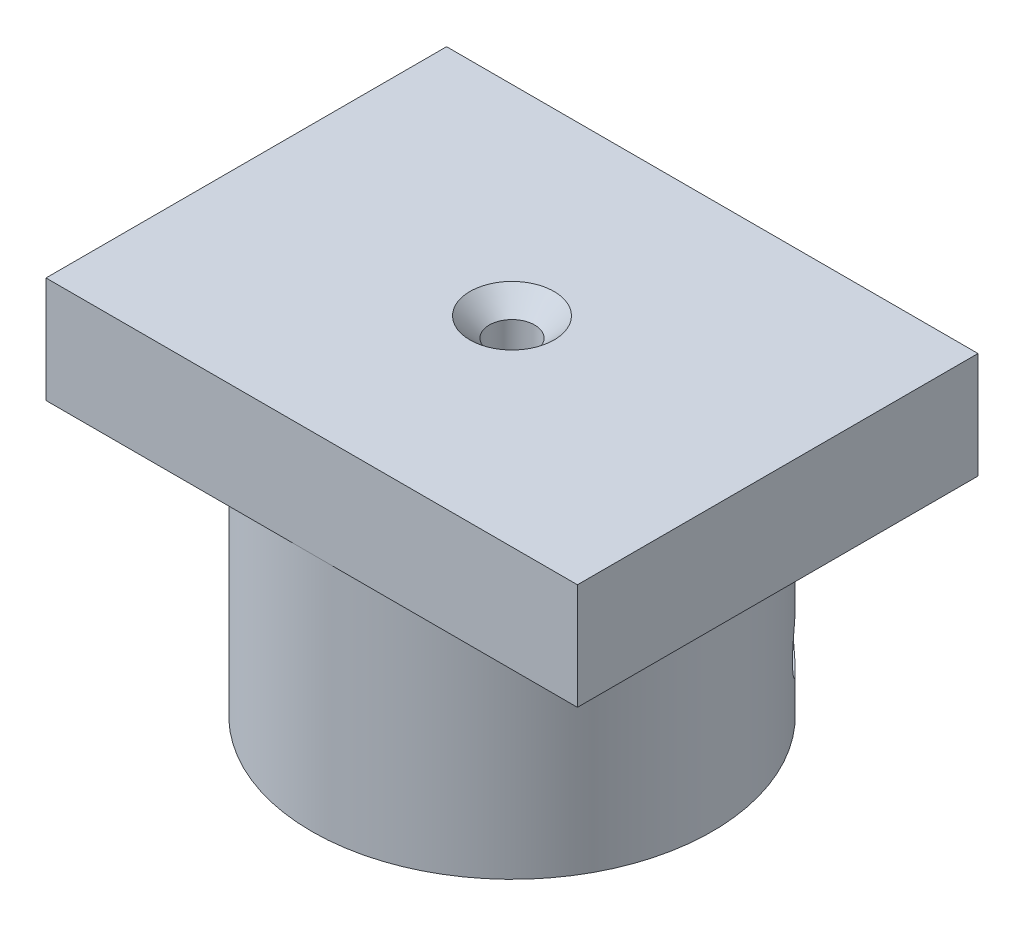
ISO-10303-21;
HEADER;
FILE_DESCRIPTION(('STEP AP214'),'2;1');
FILE_NAME('part.step','',(''),(''),'','','');
FILE_SCHEMA(('AUTOMOTIVE_DESIGN { 1 0 10303 214 1 1 1 1 }'));
ENDSEC;
DATA;
#1=APPLICATION_CONTEXT('core data for automotive mechanical design processes');
#2=APPLICATION_PROTOCOL_DEFINITION('international standard','automotive_design',2000,#1);
#3=PRODUCT_CONTEXT('',#1,'mechanical');
#4=PRODUCT('Part','Part','',(#3));
#5=PRODUCT_RELATED_PRODUCT_CATEGORY('part','',(#4));
#6=PRODUCT_DEFINITION_FORMATION('','',#4);
#7=PRODUCT_DEFINITION_CONTEXT('part definition',#1,'design');
#8=PRODUCT_DEFINITION('design','',#6,#7);
#9=PRODUCT_DEFINITION_SHAPE('','',#8);
#10=(LENGTH_UNIT() NAMED_UNIT(*) SI_UNIT(.MILLI.,.METRE.));
#11=(NAMED_UNIT(*) PLANE_ANGLE_UNIT() SI_UNIT($,.RADIAN.));
#12=(NAMED_UNIT(*) SI_UNIT($,.STERADIAN.) SOLID_ANGLE_UNIT());
#13=UNCERTAINTY_MEASURE_WITH_UNIT(LENGTH_MEASURE(1.E-05),#10,'distance_accuracy_value','');
#14=(GEOMETRIC_REPRESENTATION_CONTEXT(3) GLOBAL_UNCERTAINTY_ASSIGNED_CONTEXT((#13)) GLOBAL_UNIT_ASSIGNED_CONTEXT((#10,
#11,#12)) REPRESENTATION_CONTEXT('',''));
#15=CARTESIAN_POINT('',(0.,0.,0.));
#16=DIRECTION('',(0.,0.,1.));
#17=DIRECTION('',(1.,0.,0.));
#18=AXIS2_PLACEMENT_3D('',#15,#16,#17);
#19=CARTESIAN_POINT('',(0.,-9.,0.));
#20=DIRECTION('',(0.,1.,0.));
#21=DIRECTION('',(0.,0.,1.));
#22=AXIS2_PLACEMENT_3D('',#19,#20,#21);
#23=PLANE('',#22);
#24=CARTESIAN_POINT('',(0.,-9.,0.));
#25=DIRECTION('',(0.,1.,0.));
#26=DIRECTION('',(0.,0.,1.));
#27=AXIS2_PLACEMENT_3D('',#24,#25,#26);
#28=CIRCLE('',#27,15.);
#29=CARTESIAN_POINT('',(0.,-9.,15.));
#30=VERTEX_POINT('',#29);
#31=EDGE_CURVE('E122',#30,#30,#28,.T.);
#32=ORIENTED_EDGE('',*,*,#31,.F.);
#33=EDGE_LOOP('',(#32));
#34=FACE_BOUND('',#33,.T.);
#35=CARTESIAN_POINT('',(0.,-9.,0.));
#36=DIRECTION('',(0.,1.,0.));
#37=DIRECTION('',(0.,0.,1.));
#38=AXIS2_PLACEMENT_3D('',#35,#36,#37);
#39=CIRCLE('',#38,4.5);
#40=CARTESIAN_POINT('',(0.,-9.,4.5));
#41=VERTEX_POINT('',#40);
#42=EDGE_CURVE('E115',#41,#41,#39,.T.);
#43=ORIENTED_EDGE('',*,*,#42,.T.);
#44=EDGE_LOOP('',(#43));
#45=FACE_BOUND('',#44,.T.);
#46=ADVANCED_FACE('F42',(#34,#45),#23,.F.);
#47=CARTESIAN_POINT('',(0.,9.,0.));
#48=DIRECTION('',(0.,-1.,0.));
#49=DIRECTION('',(0.,0.,-1.));
#50=AXIS2_PLACEMENT_3D('',#47,#48,#49);
#51=CYLINDRICAL_SURFACE('',#50,15.);
#52=CARTESIAN_POINT('',(-11.9870668790203,-4.,-9.01721839803683));
#53=CARTESIAN_POINT('',(-11.9870647194374,-4.11733609285982,-9.01722318233425));
#54=CARTESIAN_POINT('',(-11.9810834568195,-4.23474250448934,-9.02518949997445));
#55=CARTESIAN_POINT('',(-11.9572380782288,-4.46627915364104,-9.05675624858933));
#56=CARTESIAN_POINT('',(-11.9393620234722,-4.58040597926817,-9.08037238716647));
#57=CARTESIAN_POINT('',(-11.89202471621,-4.80199815598241,-9.14227851980523));
#58=CARTESIAN_POINT('',(-11.8625719205642,-4.90946830361192,-9.18055780185832));
#59=CARTESIAN_POINT('',(-11.7925656103785,-5.11482926416158,-9.27030853006771));
#60=CARTESIAN_POINT('',(-11.7520137790941,-5.2127215265893,-9.32177797575742));
#61=CARTESIAN_POINT('',(-11.6601992916187,-5.3968492951197,-9.43637436255996));
#62=CARTESIAN_POINT('',(-11.6088713042299,-5.48300815716717,-9.49957212291628));
#63=CARTESIAN_POINT('',(-11.496583565522,-5.64056008303764,-9.63515952584124));
#64=CARTESIAN_POINT('',(-11.4356233066221,-5.71195236826536,-9.70754965276992));
#65=CARTESIAN_POINT('',(-11.3050035809226,-5.83822431074465,-9.85935835043236));
#66=CARTESIAN_POINT('',(-11.2353088946526,-5.89303386095597,-9.93880497397696));
#67=CARTESIAN_POINT('',(-11.0889741160552,-5.98413496420969,-10.1018134811016));
#68=CARTESIAN_POINT('',(-11.0123343446941,-6.02042737250593,-10.1853751744229));
#69=CARTESIAN_POINT('',(-10.8545306330568,-6.07323294311556,-10.3533739769108));
#70=CARTESIAN_POINT('',(-10.7733996203009,-6.08987412402075,-10.4378017648972));
#71=CARTESIAN_POINT('',(-10.608352955659,-6.10330204563422,-10.6055025569267));
#72=CARTESIAN_POINT('',(-10.5244374397326,-6.10008975431735,-10.6887756170713));
#73=CARTESIAN_POINT('',(-10.3568572549031,-6.07400360278592,-10.8512228151495));
#74=CARTESIAN_POINT('',(-10.2731949381095,-6.05126744941544,-10.9304215530207));
#75=CARTESIAN_POINT('',(-10.1080772220635,-5.9869947497972,-11.0832956509178));
#76=CARTESIAN_POINT('',(-10.0266218735772,-5.94545777146888,-11.1569708839573));
#77=CARTESIAN_POINT('',(-9.86823619922424,-5.84461923586762,-11.2973076052182));
#78=CARTESIAN_POINT('',(-9.79132183269602,-5.7852590253779,-11.3639449388141));
#79=CARTESIAN_POINT('',(-9.64484794469365,-5.65050179684024,-11.4885232952984));
#80=CARTESIAN_POINT('',(-9.57528884603068,-5.57510385762688,-11.5464638183386));
#81=CARTESIAN_POINT('',(-9.44535198486033,-5.40964253899311,-11.6530021918276));
#82=CARTESIAN_POINT('',(-9.38505801416977,-5.31945901562705,-11.7015157211278));
#83=CARTESIAN_POINT('',(-9.27656347101683,-5.12739659410495,-11.787713375521));
#84=CARTESIAN_POINT('',(-9.22836295600759,-5.02551764039006,-11.825397449166));
#85=CARTESIAN_POINT('',(-9.14586123091402,-4.81284002266163,-11.8893213041074));
#86=CARTESIAN_POINT('',(-9.11156861410267,-4.70203589456799,-11.9155540107095));
#87=CARTESIAN_POINT('',(-9.05829232273532,-4.47471532580373,-11.9561060396704));
#88=CARTESIAN_POINT('',(-9.03930771443453,-4.35819923400655,-11.9704260886689));
#89=CARTESIAN_POINT('',(-9.01751718312126,-4.12381656861352,-11.9868499372337));
#90=CARTESIAN_POINT('',(-9.01457589236332,-4.00596972893498,-11.9890559517411));
#91=CARTESIAN_POINT('',(-9.02462828094582,-3.77134786415677,-11.9814908260189));
#92=CARTESIAN_POINT('',(-9.03762153152549,-3.65457281030306,-11.9717200080573));
#93=CARTESIAN_POINT('',(-9.07892273504474,-3.425922600359,-11.9404280327459));
#94=CARTESIAN_POINT('',(-9.10716450316938,-3.31402851081475,-11.9189576525965));
#95=CARTESIAN_POINT('',(-9.17780881968122,-3.09772142332984,-11.8646449046075));
#96=CARTESIAN_POINT('',(-9.22021198357903,-2.99330875080096,-11.8318020424724));
#97=CARTESIAN_POINT('',(-9.31790005449787,-2.79417235905164,-11.7550248327029));
#98=CARTESIAN_POINT('',(-9.37326797074399,-2.69951698858569,-11.7110188530569));
#99=CARTESIAN_POINT('',(-9.49470933842137,-2.52328252675306,-11.6127765556547));
#100=CARTESIAN_POINT('',(-9.56078331499997,-2.44170407721847,-11.55853973604));
#101=CARTESIAN_POINT('',(-9.70183516839116,-2.29334139805609,-11.440406530351));
#102=CARTESIAN_POINT('',(-9.77687382387436,-2.22666810836978,-11.3764433000043));
#103=CARTESIAN_POINT('',(-9.93290485979195,-2.11077904558351,-11.2404668392276));
#104=CARTESIAN_POINT('',(-10.013897094811,-2.06156284626736,-11.1684538053907));
#105=CARTESIAN_POINT('',(-10.1788929219618,-1.98216480611367,-11.0182816810028));
#106=CARTESIAN_POINT('',(-10.2628857267959,-1.95192085772326,-10.9401435965525));
#107=CARTESIAN_POINT('',(-10.4314797404043,-1.91112436523794,-10.7795073654612));
#108=CARTESIAN_POINT('',(-10.5160809141113,-1.90057069515823,-10.6970094684127));
#109=CARTESIAN_POINT('',(-10.6826377110797,-1.89947910649295,-10.5306689168891));
#110=CARTESIAN_POINT('',(-10.7646097649384,-1.90877089588416,-10.4468437810094));
#111=CARTESIAN_POINT('',(-10.9244014046346,-1.94674328265117,-10.2796319079904));
#112=CARTESIAN_POINT('',(-11.002220999003,-1.9754238401924,-10.196245169951));
#113=CARTESIAN_POINT('',(-11.1517051228914,-2.0513020664703,-10.0325352524392));
#114=CARTESIAN_POINT('',(-11.2233730424619,-2.09848945561188,-9.95221039937599));
#115=CARTESIAN_POINT('',(-11.3589816953583,-2.21002400736845,-9.79715046373519));
#116=CARTESIAN_POINT('',(-11.4229222436622,-2.27437158074412,-9.72241551501713));
#117=CARTESIAN_POINT('',(-11.5422665504137,-2.41902194341015,-9.58043672130585));
#118=CARTESIAN_POINT('',(-11.5975961996221,-2.49945094053356,-9.51325915412913));
#119=CARTESIAN_POINT('',(-11.6980623037921,-2.67371615992384,-9.38944686647354));
#120=CARTESIAN_POINT('',(-11.7431963561439,-2.76755553388068,-9.33281463157131));
#121=CARTESIAN_POINT('',(-11.8226661611317,-2.96650942565449,-9.23194025617398));
#122=CARTESIAN_POINT('',(-11.856948383294,-3.07167651010148,-9.18775965153594));
#123=CARTESIAN_POINT('',(-11.9138123194739,-3.28988056010948,-9.11390518210486));
#124=CARTESIAN_POINT('',(-11.936406423671,-3.40290904722283,-9.0842159573823));
#125=CARTESIAN_POINT('',(-11.9643200435505,-3.59706586779625,-9.04739636357886));
#126=CARTESIAN_POINT('',(-11.9728425101404,-3.676983613116,-9.03610161530165));
#127=CARTESIAN_POINT('',(-11.9842166439747,-3.83792306136632,-9.02101101947242));
#128=CARTESIAN_POINT('',(-11.9870683708506,-3.91894475267918,-9.0172150930656));
#129=CARTESIAN_POINT('',(-11.9870668790203,-4.,-9.01721839803683));
#130=B_SPLINE_CURVE_WITH_KNOTS('',3,(#52,#53,#54,#55,#56,#57,#58,#59,#60,#61,#62,#63,#64,#65,
#66,#67,#68,#69,#70,#71,#72,#73,#74,#75,#76,#77,#78,#79,#80,#81,#82,#83,#84,#85,#86,#87,#88,#89,
#90,#91,#92,#93,#94,#95,#96,#97,#98,#99,#100,#101,#102,#103,#104,#105,#106,#107,#108,#109,#110,
#111,#112,#113,#114,#115,#116,#117,#118,#119,#120,#121,#122,#123,#124,#125,#126,#127,#128,#129),
.UNSPECIFIED.,.T.,.F.,(4,2,2,2,2,2,2,2,2,2,2,2,2,2,2,2,2,2,2,2,2,2,2,2,2,2,2,2,2,2,2,2,2,2,2,2,
2,2,4),(0.,0.351712081629503,0.70377770967343,1.05558662880037,1.40734222289433,
1.76129534484741,2.11526712488363,2.47071513169513,2.82614671989291,3.17924983410919,
3.53233573258448,3.88295149074819,4.23357530717269,4.58536585418834,4.937176612597,
5.29200235545805,5.64682978397997,6.00187611693852,6.35690079144634,6.7089252073825,
7.06094015138284,7.41143934663426,7.76195377795835,8.11477696238977,8.4676174585377,
8.82300266005486,9.17837918421788,9.53258619227279,9.88677294444673,10.2379326704126,
10.5890916749168,10.9400559042294,11.2910285352725,11.644872118138,11.9987989980588,
12.3544454803612,12.7097141772518,12.9526778626165,13.1956389930528),.UNSPECIFIED.);
#131=CARTESIAN_POINT('',(-11.9870668790203,-4.,-9.01721839803683));
#132=VERTEX_POINT('',#131);
#133=EDGE_CURVE('E224',#132,#132,#130,.T.);
#134=ORIENTED_EDGE('',*,*,#133,.T.);
#135=EDGE_LOOP('',(#134));
#136=FACE_BOUND('',#135,.T.);
#137=CARTESIAN_POINT('',(9.01721839803683,-4.,-11.9870668790203));
#138=CARTESIAN_POINT('',(9.01722318233425,-4.11733609285982,-11.9870647194374));
#139=CARTESIAN_POINT('',(9.02518949997445,-4.23474250448934,-11.9810834568195));
#140=CARTESIAN_POINT('',(9.05675624858932,-4.46627915364104,-11.9572380782288));
#141=CARTESIAN_POINT('',(9.08037238716647,-4.58040597926817,-11.9393620234722));
#142=CARTESIAN_POINT('',(9.14227851980523,-4.80199815598241,-11.89202471621));
#143=CARTESIAN_POINT('',(9.18055780185832,-4.90946830361192,-11.8625719205642));
#144=CARTESIAN_POINT('',(9.2703085300677,-5.11482926416158,-11.7925656103785));
#145=CARTESIAN_POINT('',(9.32177797575741,-5.2127215265893,-11.7520137790941));
#146=CARTESIAN_POINT('',(9.43637436255996,-5.39684929511969,-11.6601992916187));
#147=CARTESIAN_POINT('',(9.49957212291628,-5.48300815716716,-11.6088713042299));
#148=CARTESIAN_POINT('',(9.63515952584124,-5.64056008303764,-11.496583565522));
#149=CARTESIAN_POINT('',(9.70754965276992,-5.71195236826536,-11.4356233066221));
#150=CARTESIAN_POINT('',(9.85935835043235,-5.83822431074465,-11.3050035809226));
#151=CARTESIAN_POINT('',(9.93880497397696,-5.89303386095597,-11.2353088946526));
#152=CARTESIAN_POINT('',(10.1018134811016,-5.98413496420969,-11.0889741160552));
#153=CARTESIAN_POINT('',(10.1853751744229,-6.02042737250593,-11.0123343446941));
#154=CARTESIAN_POINT('',(10.3533739769108,-6.07323294311556,-10.8545306330568));
#155=CARTESIAN_POINT('',(10.4378017648972,-6.08987412402075,-10.7733996203009));
#156=CARTESIAN_POINT('',(10.6055025569267,-6.10330204563422,-10.608352955659));
#157=CARTESIAN_POINT('',(10.6887756170713,-6.10008975431734,-10.5244374397326));
#158=CARTESIAN_POINT('',(10.8512228151495,-6.07400360278592,-10.3568572549031));
#159=CARTESIAN_POINT('',(10.9304215530207,-6.05126744941544,-10.2731949381095));
#160=CARTESIAN_POINT('',(11.0832956509178,-5.9869947497972,-10.1080772220635));
#161=CARTESIAN_POINT('',(11.1569708839573,-5.94545777146887,-10.0266218735772));
#162=CARTESIAN_POINT('',(11.2973076052182,-5.84461923586762,-9.86823619922424));
#163=CARTESIAN_POINT('',(11.3639449388141,-5.78525902537789,-9.79132183269602));
#164=CARTESIAN_POINT('',(11.4885232952984,-5.65050179684023,-9.64484794469365));
#165=CARTESIAN_POINT('',(11.5464638183386,-5.57510385762687,-9.57528884603068));
#166=CARTESIAN_POINT('',(11.6530021918276,-5.40964253899311,-9.44535198486033));
#167=CARTESIAN_POINT('',(11.7015157211278,-5.31945901562705,-9.38505801416977));
#168=CARTESIAN_POINT('',(11.787713375521,-5.12739659410495,-9.27656347101683));
#169=CARTESIAN_POINT('',(11.825397449166,-5.02551764039006,-9.22836295600759));
#170=CARTESIAN_POINT('',(11.8893213041074,-4.81284002266163,-9.14586123091402));
#171=CARTESIAN_POINT('',(11.9155540107095,-4.70203589456799,-9.11156861410267));
#172=CARTESIAN_POINT('',(11.9561060396704,-4.47471532580373,-9.05829232273532));
#173=CARTESIAN_POINT('',(11.9704260886689,-4.35819923400655,-9.03930771443453));
#174=CARTESIAN_POINT('',(11.9868499372337,-4.12381656861352,-9.01751718312126));
#175=CARTESIAN_POINT('',(11.9890559517411,-4.00596972893497,-9.01457589236332));
#176=CARTESIAN_POINT('',(11.9814908260189,-3.77134786415676,-9.02462828094582));
#177=CARTESIAN_POINT('',(11.9717200080573,-3.65457281030306,-9.03762153152549));
#178=CARTESIAN_POINT('',(11.9404280327459,-3.425922600359,-9.07892273504475));
#179=CARTESIAN_POINT('',(11.9189576525965,-3.31402851081474,-9.10716450316939));
#180=CARTESIAN_POINT('',(11.8646449046075,-3.09772142332984,-9.17780881968122));
#181=CARTESIAN_POINT('',(11.8318020424724,-2.99330875080096,-9.22021198357903));
#182=CARTESIAN_POINT('',(11.7550248327029,-2.79417235905164,-9.31790005449787));
#183=CARTESIAN_POINT('',(11.7110188530569,-2.69951698858568,-9.373267970744));
#184=CARTESIAN_POINT('',(11.6127765556547,-2.52328252675306,-9.49470933842138));
#185=CARTESIAN_POINT('',(11.55853973604,-2.44170407721847,-9.56078331499998));
#186=CARTESIAN_POINT('',(11.440406530351,-2.29334139805609,-9.70183516839116));
#187=CARTESIAN_POINT('',(11.3764433000043,-2.22666810836978,-9.77687382387436));
#188=CARTESIAN_POINT('',(11.2404668392276,-2.11077904558351,-9.93290485979196));
#189=CARTESIAN_POINT('',(11.1684538053907,-2.06156284626736,-10.013897094811));
#190=CARTESIAN_POINT('',(11.0182816810028,-1.98216480611367,-10.1788929219618));
#191=CARTESIAN_POINT('',(10.9401435965525,-1.95192085772326,-10.2628857267959));
#192=CARTESIAN_POINT('',(10.7795073654612,-1.91112436523794,-10.4314797404043));
#193=CARTESIAN_POINT('',(10.6970094684127,-1.90057069515823,-10.5160809141113));
#194=CARTESIAN_POINT('',(10.5306689168891,-1.89947910649294,-10.6826377110797));
#195=CARTESIAN_POINT('',(10.4468437810094,-1.90877089588415,-10.7646097649384));
#196=CARTESIAN_POINT('',(10.2796319079904,-1.94674328265117,-10.9244014046346));
#197=CARTESIAN_POINT('',(10.196245169951,-1.9754238401924,-11.002220999003));
#198=CARTESIAN_POINT('',(10.0325352524392,-2.0513020664703,-11.1517051228914));
#199=CARTESIAN_POINT('',(9.95221039937599,-2.09848945561188,-11.2233730424619));
#200=CARTESIAN_POINT('',(9.79715046373519,-2.21002400736845,-11.3589816953583));
#201=CARTESIAN_POINT('',(9.72241551501713,-2.27437158074412,-11.4229222436622));
#202=CARTESIAN_POINT('',(9.58043672130585,-2.41902194341015,-11.5422665504137));
#203=CARTESIAN_POINT('',(9.51325915412913,-2.49945094053356,-11.5975961996221));
#204=CARTESIAN_POINT('',(9.38944686647354,-2.67371615992384,-11.6980623037921));
#205=CARTESIAN_POINT('',(9.33281463157131,-2.76755553388068,-11.7431963561439));
#206=CARTESIAN_POINT('',(9.23194025617398,-2.96650942565449,-11.8226661611317));
#207=CARTESIAN_POINT('',(9.18775965153594,-3.07167651010147,-11.856948383294));
#208=CARTESIAN_POINT('',(9.11390518210486,-3.28988056010948,-11.9138123194739));
#209=CARTESIAN_POINT('',(9.0842159573823,-3.40290904722282,-11.936406423671));
#210=CARTESIAN_POINT('',(9.04739636357886,-3.59706586779624,-11.9643200435505));
#211=CARTESIAN_POINT('',(9.03610161530165,-3.676983613116,-11.9728425101404));
#212=CARTESIAN_POINT('',(9.02101101947242,-3.83792306136632,-11.9842166439747));
#213=CARTESIAN_POINT('',(9.0172150930656,-3.91894475267917,-11.9870683708506));
#214=CARTESIAN_POINT('',(9.01721839803683,-4.,-11.9870668790203));
#215=B_SPLINE_CURVE_WITH_KNOTS('',3,(#137,#138,#139,#140,#141,#142,#143,#144,#145,#146,#147,
#148,#149,#150,#151,#152,#153,#154,#155,#156,#157,#158,#159,#160,#161,#162,#163,#164,#165,#166,
#167,#168,#169,#170,#171,#172,#173,#174,#175,#176,#177,#178,#179,#180,#181,#182,#183,#184,#185,
#186,#187,#188,#189,#190,#191,#192,#193,#194,#195,#196,#197,#198,#199,#200,#201,#202,#203,#204,
#205,#206,#207,#208,#209,#210,#211,#212,#213,#214),.UNSPECIFIED.,.T.,.F.,(4,2,2,2,2,2,2,2,2,2,2,
2,2,2,2,2,2,2,2,2,2,2,2,2,2,2,2,2,2,2,2,2,2,2,2,2,2,2,4),(0.,0.351712081629503,0.70377770967343,
1.05558662880037,1.40734222289433,1.76129534484741,2.11526712488363,2.47071513169513,
2.82614671989291,3.1792498341092,3.53233573258448,3.88295149074819,4.23357530717269,
4.58536585418835,4.937176612597,5.29200235545805,5.64682978397998,6.00187611693852,
6.35690079144634,6.70892520738251,7.06094015138284,7.41143934663426,7.76195377795835,
8.11477696238977,8.4676174585377,8.82300266005486,9.17837918421788,9.53258619227279,
9.88677294444672,10.2379326704126,10.5890916749168,10.9400559042294,11.2910285352725,
11.644872118138,11.9987989980588,12.3544454803612,12.7097141772518,12.9526778626165,
13.1956389930528),.UNSPECIFIED.);
#216=CARTESIAN_POINT('',(9.01721839803683,-4.,-11.9870668790203));
#217=VERTEX_POINT('',#216);
#218=EDGE_CURVE('E160',#217,#217,#215,.T.);
#219=ORIENTED_EDGE('',*,*,#218,.T.);
#220=EDGE_LOOP('',(#219));
#221=FACE_BOUND('',#220,.T.);
#222=CARTESIAN_POINT('',(0.,9.,0.));
#223=DIRECTION('',(0.,1.,0.));
#224=DIRECTION('',(0.,0.,1.));
#225=AXIS2_PLACEMENT_3D('',#222,#223,#224);
#226=CIRCLE('',#225,15.);
#227=CARTESIAN_POINT('',(0.,9.,15.));
#228=VERTEX_POINT('',#227);
#229=CARTESIAN_POINT('',(0.,9.,-15.));
#230=VERTEX_POINT('',#229);
#231=EDGE_CURVE('E11',#228,#230,#226,.T.);
#232=ORIENTED_EDGE('',*,*,#231,.F.);
#233=EDGE_CURVE('E52',#230,#228,#226,.T.);
#234=ORIENTED_EDGE('',*,*,#233,.F.);
#235=EDGE_LOOP('',(#232,#234));
#236=FACE_BOUND('',#235,.T.);
#237=ORIENTED_EDGE('',*,*,#31,.T.);
#238=EDGE_LOOP('',(#237));
#239=FACE_BOUND('',#238,.T.);
#240=ADVANCED_FACE('F44',(#136,#221,#236,#239),#51,.T.);
#241=CARTESIAN_POINT('',(0.,9.,0.));
#242=DIRECTION('',(0.,-1.,0.));
#243=DIRECTION('',(0.,0.,-1.));
#244=AXIS2_PLACEMENT_3D('',#241,#242,#243);
#245=CYLINDRICAL_SURFACE('',#244,4.5);
#246=CARTESIAN_POINT('',(-4.29917369638581,-4.,-1.32932521540231));
#247=CARTESIAN_POINT('',(-4.29917440683888,-4.1105159488515,-1.3293363655585));
#248=CARTESIAN_POINT('',(-4.29626776466147,-4.22119968825855,-1.33883805604156));
#249=CARTESIAN_POINT('',(-4.28447211953719,-4.43925479145037,-1.37610263071616));
#250=CARTESIAN_POINT('',(-4.27556892680696,-4.54661766525749,-1.40390882576244));
#251=CARTESIAN_POINT('',(-4.25137723187338,-4.75447869771575,-1.47553371962599));
#252=CARTESIAN_POINT('',(-4.23611925151373,-4.85500703302842,-1.51927575495533));
#253=CARTESIAN_POINT('',(-4.19857759084312,-5.04761316471376,-1.62013329879297));
#254=CARTESIAN_POINT('',(-4.17629435327819,-5.13969149315109,-1.6772479644725));
#255=CARTESIAN_POINT('',(-4.12206207563411,-5.32006167670336,-1.80661521200534));
#256=CARTESIAN_POINT('',(-4.0895367472349,-5.40761442116858,-1.87965720253701));
#257=CARTESIAN_POINT('',(-4.01459634006222,-5.56952105940296,-2.03480660528675));
#258=CARTESIAN_POINT('',(-3.97217685799723,-5.64386905050617,-2.11691804517946));
#259=CARTESIAN_POINT('',(-3.87399552884372,-5.78137729727464,-2.29189220670154));
#260=CARTESIAN_POINT('',(-3.81761204926209,-5.84366074624518,-2.38510079664142));
#261=CARTESIAN_POINT('',(-3.69276004680403,-5.94921767890719,-2.5741643722402));
#262=CARTESIAN_POINT('',(-3.62429822012235,-5.99250164970584,-2.67001786686098));
#263=CARTESIAN_POINT('',(-3.48083333887544,-6.05600963039461,-2.85421635479289));
#264=CARTESIAN_POINT('',(-3.40651926982533,-6.07752060291264,-2.94265237712052));
#265=CARTESIAN_POINT('',(-3.24982871953686,-6.10107688643711,-3.11482494195819));
#266=CARTESIAN_POINT('',(-3.16745643702872,-6.10313228076181,-3.19856389646217));
#267=CARTESIAN_POINT('',(-3.00387966625008,-6.08829119104644,-3.3523662076348));
#268=CARTESIAN_POINT('',(-2.92306212742691,-6.07282304563875,-3.42298522681672));
#269=CARTESIAN_POINT('',(-2.75948704478729,-6.02588453614518,-3.55617195058427));
#270=CARTESIAN_POINT('',(-2.67672935733081,-5.99441298364605,-3.61873905680229));
#271=CARTESIAN_POINT('',(-2.51075918478506,-5.91606558296981,-3.73584898086935));
#272=CARTESIAN_POINT('',(-2.4275583257586,-5.86896698565269,-3.79025820127263));
#273=CARTESIAN_POINT('',(-2.26464866728493,-5.76096305807958,-3.88979346163159));
#274=CARTESIAN_POINT('',(-2.18494116112454,-5.70005266517871,-3.9349160860336));
#275=CARTESIAN_POINT('',(-2.02507026851058,-5.56017187982676,-4.01969630081873));
#276=CARTESIAN_POINT('',(-1.94544464321015,-5.48010609791777,-4.05856272620436));
#277=CARTESIAN_POINT('',(-1.79654483681648,-5.30717499349428,-4.12663823399899));
#278=CARTESIAN_POINT('',(-1.72727686872817,-5.21430205233664,-4.15584153265071));
#279=CARTESIAN_POINT('',(-1.59935723642637,-5.01267439268035,-4.20678470013747));
#280=CARTESIAN_POINT('',(-1.54140458963407,-4.90335964458856,-4.22808133055995));
#281=CARTESIAN_POINT('',(-1.44465987715939,-4.67533318716908,-4.26211413033371));
#282=CARTESIAN_POINT('',(-1.40585021420025,-4.5566302249359,-4.27485816559896));
#283=CARTESIAN_POINT('',(-1.35282576894231,-4.32260448104805,-4.29192127671103));
#284=CARTESIAN_POINT('',(-1.33698942350054,-4.20769225077823,-4.29679889187388));
#285=CARTESIAN_POINT('',(-1.32603998866045,-3.9768152649785,-4.30019327620342));
#286=CARTESIAN_POINT('',(-1.33091603679448,-3.86085109296752,-4.29871337951741));
#287=CARTESIAN_POINT('',(-1.35955132597165,-3.64212789861225,-4.28973189552183));
#288=CARTESIAN_POINT('',(-1.38158871971036,-3.53911315859935,-4.28277879464904));
#289=CARTESIAN_POINT('',(-1.44085849747327,-3.33813113882503,-4.26320223225871));
#290=CARTESIAN_POINT('',(-1.47809511543458,-3.24016527406301,-4.25057719065128));
#291=CARTESIAN_POINT('',(-1.56758452788269,-3.04698321172088,-4.21841560825621));
#292=CARTESIAN_POINT('',(-1.62044901736777,-2.95210053442099,-4.19858798031037));
#293=CARTESIAN_POINT('',(-1.73770991945224,-2.77178849790098,-4.15142810064032));
#294=CARTESIAN_POINT('',(-1.80211202589641,-2.68636384007107,-4.12409213996629));
#295=CARTESIAN_POINT('',(-1.94718674831568,-2.51786563007551,-4.05776716937998));
#296=CARTESIAN_POINT('',(-2.02886246554262,-2.43601752324511,-4.01784542192987));
#297=CARTESIAN_POINT('',(-2.19966258059804,-2.28759519198109,-3.92693751623736));
#298=CARTESIAN_POINT('',(-2.28878853628695,-2.22102417297258,-3.87594904034262));
#299=CARTESIAN_POINT('',(-2.4722870979924,-2.10433950761138,-3.76160035682704));
#300=CARTESIAN_POINT('',(-2.56671749242898,-2.05448162289853,-3.69806962594047));
#301=CARTESIAN_POINT('',(-2.75558787011749,-1.97471539554906,-3.55955158859125));
#302=CARTESIAN_POINT('',(-2.85002779096662,-1.94479184595176,-3.48457306890281));
#303=CARTESIAN_POINT('',(-3.02716422850571,-1.90799640953973,-3.33148998020955));
#304=CARTESIAN_POINT('',(-3.11018291538756,-1.89940858853186,-3.25416899283142));
#305=CARTESIAN_POINT('',(-3.27001294180018,-1.90065432660445,-3.09351568986245));
#306=CARTESIAN_POINT('',(-3.34682592735217,-1.9104829839915,-3.01018497948341));
#307=CARTESIAN_POINT('',(-3.48827233962813,-1.94708126284899,-2.8448524658742));
#308=CARTESIAN_POINT('',(-3.55333300631533,-1.97293644690146,-2.76300972848697));
#309=CARTESIAN_POINT('',(-3.6748954848752,-2.03972283277443,-2.59914589051743));
#310=CARTESIAN_POINT('',(-3.73139590346926,-2.08065648507638,-2.51712476309904));
#311=CARTESIAN_POINT('',(-3.83783185009661,-2.17844641896538,-2.35183926852552));
#312=CARTESIAN_POINT('',(-3.88735340573543,-2.23594066372336,-2.2686872358736));
#313=CARTESIAN_POINT('',(-3.97688314066142,-2.36437414824144,-2.10781634075671));
#314=CARTESIAN_POINT('',(-4.01688702346123,-2.4353194342294,-2.03009994319151));
#315=CARTESIAN_POINT('',(-4.0911006363106,-2.59588339469264,-1.87638021016834));
#316=CARTESIAN_POINT('',(-4.12449948678122,-2.68659164443237,-1.80111892617297));
#317=CARTESIAN_POINT('',(-4.18180580258478,-2.88025606352497,-1.66374650498098));
#318=CARTESIAN_POINT('',(-4.20570655062439,-2.98322083435153,-1.60164468892323));
#319=CARTESIAN_POINT('',(-4.24529307438374,-3.20073846136662,-1.49361084097047));
#320=CARTESIAN_POINT('',(-4.26086411424616,-3.31542847183715,-1.44790736748277));
#321=CARTESIAN_POINT('',(-4.27829207009282,-3.49244181474218,-1.39518649552518));
#322=CARTESIAN_POINT('',(-4.28311156285306,-3.55221842780699,-1.38025843637557));
#323=CARTESIAN_POINT('',(-4.29086648960824,-3.67299710555519,-1.35596164840087));
#324=CARTESIAN_POINT('',(-4.29380330061631,-3.73399824085331,-1.34658885677438));
#325=CARTESIAN_POINT('',(-4.29694173530168,-3.82929674984875,-1.33652704787926));
#326=CARTESIAN_POINT('',(-4.2977790568385,-3.86337395752291,-1.33382951302306));
#327=CARTESIAN_POINT('',(-4.29889494033076,-3.93162875298877,-1.33022683061059));
#328=CARTESIAN_POINT('',(-4.2991734765715,-3.96580634532759,-1.32932176554196));
#329=CARTESIAN_POINT('',(-4.29917369638581,-4.,-1.32932521540231));
#330=B_SPLINE_CURVE_WITH_KNOTS('',3,(#246,#247,#248,#249,#250,#251,#252,#253,#254,#255,#256,
#257,#258,#259,#260,#261,#262,#263,#264,#265,#266,#267,#268,#269,#270,#271,#272,#273,#274,#275,
#276,#277,#278,#279,#280,#281,#282,#283,#284,#285,#286,#287,#288,#289,#290,#291,#292,#293,#294,
#295,#296,#297,#298,#299,#300,#301,#302,#303,#304,#305,#306,#307,#308,#309,#310,#311,#312,#313,
#314,#315,#316,#317,#318,#319,#320,#321,#322,#323,#324,#325,#326,#327,#328,#329),.UNSPECIFIED.,
.T.,.F.,(4,2,2,2,2,2,2,2,2,2,2,2,2,2,2,2,2,2,2,2,2,2,2,2,2,2,2,2,2,2,2,2,2,2,2,2,2,2,2,2,2,4),
(0.,0.331410528467239,0.66360804987466,0.994228108234423,1.32482733440823,1.6790185526224,
2.0333677017819,2.40787056550708,2.78216645483483,3.13275448356797,3.48316080172339,
3.80693872430263,4.13074069414715,4.45937206167797,4.78812408267758,5.14483569343424,
5.50176042538406,5.87643021003266,6.25075493286701,6.59709993374151,6.94326331887267,
7.258572246167,7.57396906677782,7.90386716346367,8.2339285164845,8.59923999097633,
8.96462804486153,9.3353764468273,9.7058416975229,10.0453781306182,10.3848242062054,
10.7064881473612,11.0282043869011,11.3645119598872,11.7009710626895,12.0668074907532,
12.432902188912,12.8039175863161,12.9890832315957,13.1741132897981,13.2766470491849,
13.3791855269609),.UNSPECIFIED.);
#331=CARTESIAN_POINT('',(-4.29917369638581,-4.,-1.32932521540231));
#332=VERTEX_POINT('',#331);
#333=EDGE_CURVE('E228',#332,#332,#330,.T.);
#334=ORIENTED_EDGE('',*,*,#333,.F.);
#335=EDGE_LOOP('',(#334));
#336=FACE_BOUND('',#335,.T.);
#337=CARTESIAN_POINT('',(1.32932521540231,-4.,-4.29917369638581));
#338=CARTESIAN_POINT('',(1.3293363655585,-4.1105159488515,-4.29917440683888));
#339=CARTESIAN_POINT('',(1.33883805604156,-4.22119968825855,-4.29626776466147));
#340=CARTESIAN_POINT('',(1.37610263071616,-4.43925479145036,-4.28447211953719));
#341=CARTESIAN_POINT('',(1.40390882576244,-4.54661766525748,-4.27556892680696));
#342=CARTESIAN_POINT('',(1.47553371962599,-4.75447869771575,-4.25137723187338));
#343=CARTESIAN_POINT('',(1.51927575495533,-4.85500703302841,-4.23611925151373));
#344=CARTESIAN_POINT('',(1.62013329879297,-5.04761316471376,-4.19857759084313));
#345=CARTESIAN_POINT('',(1.6772479644725,-5.13969149315109,-4.17629435327819));
#346=CARTESIAN_POINT('',(1.80661521200533,-5.32006167670335,-4.12206207563411));
#347=CARTESIAN_POINT('',(1.87965720253701,-5.40761442116857,-4.08953674723491));
#348=CARTESIAN_POINT('',(2.03480660528675,-5.56952105940295,-4.01459634006222));
#349=CARTESIAN_POINT('',(2.11691804517946,-5.64386905050617,-3.97217685799723));
#350=CARTESIAN_POINT('',(2.29189220670154,-5.78137729727464,-3.87399552884372));
#351=CARTESIAN_POINT('',(2.38510079664142,-5.84366074624518,-3.81761204926209));
#352=CARTESIAN_POINT('',(2.5741643722402,-5.94921767890719,-3.69276004680403));
#353=CARTESIAN_POINT('',(2.67001786686098,-5.99250164970584,-3.62429822012235));
#354=CARTESIAN_POINT('',(2.85421635479289,-6.05600963039461,-3.48083333887544));
#355=CARTESIAN_POINT('',(2.94265237712052,-6.07752060291264,-3.40651926982534));
#356=CARTESIAN_POINT('',(3.11482494195819,-6.10107688643711,-3.24982871953687));
#357=CARTESIAN_POINT('',(3.19856389646217,-6.10313228076181,-3.16745643702872));
#358=CARTESIAN_POINT('',(3.3523662076348,-6.08829119104643,-3.00387966625008));
#359=CARTESIAN_POINT('',(3.42298522681672,-6.07282304563875,-2.92306212742691));
#360=CARTESIAN_POINT('',(3.55617195058427,-6.02588453614518,-2.7594870447873));
#361=CARTESIAN_POINT('',(3.61873905680229,-5.99441298364605,-2.67672935733081));
#362=CARTESIAN_POINT('',(3.73584898086935,-5.91606558296981,-2.51075918478507));
#363=CARTESIAN_POINT('',(3.79025820127263,-5.86896698565269,-2.42755832575861));
#364=CARTESIAN_POINT('',(3.88979346163159,-5.76096305807958,-2.26464866728493));
#365=CARTESIAN_POINT('',(3.9349160860336,-5.70005266517871,-2.18494116112454));
#366=CARTESIAN_POINT('',(4.01969630081873,-5.56017187982676,-2.02507026851059));
#367=CARTESIAN_POINT('',(4.05856272620436,-5.48010609791777,-1.94544464321015));
#368=CARTESIAN_POINT('',(4.12663823399899,-5.30717499349428,-1.79654483681648));
#369=CARTESIAN_POINT('',(4.15584153265071,-5.21430205233664,-1.72727686872818));
#370=CARTESIAN_POINT('',(4.20678470013747,-5.01267439268035,-1.59935723642637));
#371=CARTESIAN_POINT('',(4.22808133055995,-4.90335964458856,-1.54140458963407));
#372=CARTESIAN_POINT('',(4.26211413033371,-4.67533318716908,-1.4446598771594));
#373=CARTESIAN_POINT('',(4.27485816559896,-4.55663022493589,-1.40585021420025));
#374=CARTESIAN_POINT('',(4.29192127671102,-4.32260448104805,-1.35282576894231));
#375=CARTESIAN_POINT('',(4.29679889187388,-4.20769225077822,-1.33698942350054));
#376=CARTESIAN_POINT('',(4.30019327620342,-3.9768152649785,-1.32603998866046));
#377=CARTESIAN_POINT('',(4.29871337951741,-3.86085109296752,-1.33091603679448));
#378=CARTESIAN_POINT('',(4.28973189552183,-3.64212789861225,-1.35955132597166));
#379=CARTESIAN_POINT('',(4.28277879464903,-3.53911315859935,-1.38158871971036));
#380=CARTESIAN_POINT('',(4.26320223225871,-3.33813113882503,-1.44085849747327));
#381=CARTESIAN_POINT('',(4.25057719065128,-3.24016527406301,-1.47809511543458));
#382=CARTESIAN_POINT('',(4.21841560825621,-3.04698321172088,-1.56758452788269));
#383=CARTESIAN_POINT('',(4.19858798031037,-2.95210053442098,-1.62044901736777));
#384=CARTESIAN_POINT('',(4.15142810064032,-2.77178849790098,-1.73770991945225));
#385=CARTESIAN_POINT('',(4.12409213996629,-2.68636384007107,-1.80211202589642));
#386=CARTESIAN_POINT('',(4.05776716937997,-2.51786563007551,-1.94718674831569));
#387=CARTESIAN_POINT('',(4.01784542192986,-2.4360175232451,-2.02886246554262));
#388=CARTESIAN_POINT('',(3.92693751623736,-2.28759519198109,-2.19966258059804));
#389=CARTESIAN_POINT('',(3.87594904034262,-2.22102417297258,-2.28878853628695));
#390=CARTESIAN_POINT('',(3.76160035682704,-2.10433950761138,-2.4722870979924));
#391=CARTESIAN_POINT('',(3.69806962594047,-2.05448162289853,-2.56671749242899));
#392=CARTESIAN_POINT('',(3.55955158859124,-1.97471539554906,-2.75558787011749));
#393=CARTESIAN_POINT('',(3.48457306890281,-1.94479184595175,-2.85002779096662));
#394=CARTESIAN_POINT('',(3.33148998020954,-1.90799640953973,-3.02716422850571));
#395=CARTESIAN_POINT('',(3.25416899283142,-1.89940858853186,-3.11018291538757));
#396=CARTESIAN_POINT('',(3.09351568986244,-1.90065432660445,-3.27001294180019));
#397=CARTESIAN_POINT('',(3.01018497948341,-1.9104829839915,-3.34682592735217));
#398=CARTESIAN_POINT('',(2.8448524658742,-1.94708126284899,-3.48827233962813));
#399=CARTESIAN_POINT('',(2.76300972848697,-1.97293644690146,-3.55333300631533));
#400=CARTESIAN_POINT('',(2.59914589051742,-2.03972283277443,-3.6748954848752));
#401=CARTESIAN_POINT('',(2.51712476309904,-2.08065648507637,-3.73139590346926));
#402=CARTESIAN_POINT('',(2.35183926852552,-2.17844641896538,-3.83783185009661));
#403=CARTESIAN_POINT('',(2.2686872358736,-2.23594066372336,-3.88735340573543));
#404=CARTESIAN_POINT('',(2.10781634075671,-2.36437414824143,-3.97688314066142));
#405=CARTESIAN_POINT('',(2.03009994319151,-2.4353194342294,-4.01688702346124));
#406=CARTESIAN_POINT('',(1.87638021016833,-2.59588339469264,-4.0911006363106));
#407=CARTESIAN_POINT('',(1.80111892617297,-2.68659164443237,-4.12449948678122));
#408=CARTESIAN_POINT('',(1.66374650498097,-2.88025606352497,-4.18180580258478));
#409=CARTESIAN_POINT('',(1.60164468892323,-2.98322083435153,-4.20570655062439));
#410=CARTESIAN_POINT('',(1.49361084097047,-3.20073846136662,-4.24529307438374));
#411=CARTESIAN_POINT('',(1.44790736748276,-3.31542847183715,-4.26086411424616));
#412=CARTESIAN_POINT('',(1.39518649552518,-3.49244181474218,-4.27829207009282));
#413=CARTESIAN_POINT('',(1.38025843637557,-3.55221842780699,-4.28311156285306));
#414=CARTESIAN_POINT('',(1.35596164840087,-3.67299710555518,-4.29086648960824));
#415=CARTESIAN_POINT('',(1.34658885677438,-3.73399824085331,-4.29380330061631));
#416=CARTESIAN_POINT('',(1.33652704787925,-3.82929674984874,-4.29694173530168));
#417=CARTESIAN_POINT('',(1.33382951302305,-3.8633739575229,-4.2977790568385));
#418=CARTESIAN_POINT('',(1.33022683061059,-3.93162875298876,-4.29889494033077));
#419=CARTESIAN_POINT('',(1.32932176554196,-3.96580634532759,-4.2991734765715));
#420=CARTESIAN_POINT('',(1.32932521540231,-4.,-4.29917369638581));
#421=B_SPLINE_CURVE_WITH_KNOTS('',3,(#337,#338,#339,#340,#341,#342,#343,#344,#345,#346,#347,
#348,#349,#350,#351,#352,#353,#354,#355,#356,#357,#358,#359,#360,#361,#362,#363,#364,#365,#366,
#367,#368,#369,#370,#371,#372,#373,#374,#375,#376,#377,#378,#379,#380,#381,#382,#383,#384,#385,
#386,#387,#388,#389,#390,#391,#392,#393,#394,#395,#396,#397,#398,#399,#400,#401,#402,#403,#404,
#405,#406,#407,#408,#409,#410,#411,#412,#413,#414,#415,#416,#417,#418,#419,#420),.UNSPECIFIED.,
.T.,.F.,(4,2,2,2,2,2,2,2,2,2,2,2,2,2,2,2,2,2,2,2,2,2,2,2,2,2,2,2,2,2,2,2,2,2,2,2,2,2,2,2,2,4),
(0.,0.331410528467239,0.66360804987466,0.994228108234422,1.32482733440823,1.6790185526224,
2.0333677017819,2.40787056550708,2.78216645483483,3.13275448356797,3.48316080172339,
3.80693872430263,4.13074069414715,4.45937206167797,4.78812408267758,5.14483569343424,
5.50176042538406,5.87643021003265,6.25075493286701,6.59709993374151,6.94326331887267,
7.258572246167,7.57396906677782,7.90386716346366,8.2339285164845,8.59923999097633,
8.96462804486153,9.3353764468273,9.7058416975229,10.0453781306182,10.3848242062054,
10.7064881473612,11.0282043869011,11.3645119598872,11.7009710626895,12.0668074907532,
12.432902188912,12.8039175863161,12.9890832315957,13.1741132897981,13.2766470491849,
13.3791855269609),.UNSPECIFIED.);
#422=CARTESIAN_POINT('',(1.32932521540231,-4.,-4.29917369638581));
#423=VERTEX_POINT('',#422);
#424=EDGE_CURVE('E167',#423,#423,#421,.T.);
#425=ORIENTED_EDGE('',*,*,#424,.F.);
#426=EDGE_LOOP('',(#425));
#427=FACE_BOUND('',#426,.T.);
#428=CARTESIAN_POINT('',(0.,9.,0.));
#429=DIRECTION('',(0.,1.,0.));
#430=DIRECTION('',(0.,0.,1.));
#431=AXIS2_PLACEMENT_3D('',#428,#429,#430);
#432=CIRCLE('',#431,4.5);
#433=CARTESIAN_POINT('',(0.,9.,4.5));
#434=VERTEX_POINT('',#433);
#435=EDGE_CURVE('E112',#434,#434,#432,.T.);
#436=ORIENTED_EDGE('',*,*,#435,.T.);
#437=EDGE_LOOP('',(#436));
#438=FACE_BOUND('',#437,.T.);
#439=ORIENTED_EDGE('',*,*,#42,.F.);
#440=EDGE_LOOP('',(#439));
#441=FACE_BOUND('',#440,.T.);
#442=ADVANCED_FACE('F207',(#336,#427,#438,#441),#245,.F.);
#443=CARTESIAN_POINT('',(0.,9.,0.));
#444=DIRECTION('',(0.,1.,0.));
#445=DIRECTION('',(0.,0.,1.));
#446=AXIS2_PLACEMENT_3D('',#443,#444,#445);
#447=PLANE('',#446);
#448=DIRECTION('',(1.,0.,0.));
#449=VECTOR('',#448,1.);
#450=CARTESIAN_POINT('',(19.9,9.,15.));
#451=LINE('',#450,#449);
#452=CARTESIAN_POINT('',(19.9,9.,15.));
#453=VERTEX_POINT('',#452);
#454=EDGE_CURVE('E135',#228,#453,#451,.T.);
#455=ORIENTED_EDGE('',*,*,#454,.F.);
#456=ORIENTED_EDGE('',*,*,#231,.T.);
#457=DIRECTION('',(-1.,0.,0.));
#458=VECTOR('',#457,1.);
#459=CARTESIAN_POINT('',(19.9,9.,-15.));
#460=LINE('',#459,#458);
#461=CARTESIAN_POINT('',(19.9,9.,-15.));
#462=VERTEX_POINT('',#461);
#463=EDGE_CURVE('E107',#462,#230,#460,.T.);
#464=ORIENTED_EDGE('',*,*,#463,.F.);
#465=DIRECTION('',(0.,0.,-1.));
#466=VECTOR('',#465,1.);
#467=CARTESIAN_POINT('',(19.9,9.,15.));
#468=LINE('',#467,#466);
#469=EDGE_CURVE('E138',#453,#462,#468,.T.);
#470=ORIENTED_EDGE('',*,*,#469,.F.);
#471=EDGE_LOOP('',(#455,#456,#464,#470));
#472=FACE_BOUND('',#471,.T.);
#473=ADVANCED_FACE('F136',(#472),#447,.F.);
#474=CARTESIAN_POINT('',(-19.9,9.,-15.));
#475=VERTEX_POINT('',#474);
#476=EDGE_CURVE('E131',#230,#475,#460,.T.);
#477=ORIENTED_EDGE('',*,*,#476,.F.);
#478=ORIENTED_EDGE('',*,*,#233,.T.);
#479=CARTESIAN_POINT('',(-19.9,9.,15.));
#480=VERTEX_POINT('',#479);
#481=EDGE_CURVE('E130',#480,#228,#451,.T.);
#482=ORIENTED_EDGE('',*,*,#481,.F.);
#483=DIRECTION('',(0.,0.,1.));
#484=VECTOR('',#483,1.);
#485=CARTESIAN_POINT('',(-19.9,9.,15.));
#486=LINE('',#485,#484);
#487=EDGE_CURVE('E111',#475,#480,#486,.T.);
#488=ORIENTED_EDGE('',*,*,#487,.F.);
#489=EDGE_LOOP('',(#477,#478,#482,#488));
#490=FACE_BOUND('',#489,.T.);
#491=ADVANCED_FACE('F129',(#490),#447,.F.);
#492=CARTESIAN_POINT('',(0.,16.95,0.));
#493=DIRECTION('',(0.,1.,0.));
#494=DIRECTION('',(0.,0.,1.));
#495=AXIS2_PLACEMENT_3D('',#492,#493,#494);
#496=PLANE('',#495);
#497=CARTESIAN_POINT('',(0.,16.95,0.));
#498=DIRECTION('',(0.,1.,0.));
#499=DIRECTION('',(0.,0.,1.));
#500=AXIS2_PLACEMENT_3D('',#497,#498,#499);
#501=CIRCLE('',#500,3.15);
#502=CARTESIAN_POINT('',(0.,16.95,3.15));
#503=VERTEX_POINT('',#502);
#504=EDGE_CURVE('E157',#503,#503,#501,.T.);
#505=ORIENTED_EDGE('',*,*,#504,.F.);
#506=EDGE_LOOP('',(#505));
#507=FACE_BOUND('',#506,.T.);
#508=DIRECTION('',(0.,0.,1.));
#509=VECTOR('',#508,1.);
#510=CARTESIAN_POINT('',(-19.9,16.95,15.));
#511=LINE('',#510,#509);
#512=CARTESIAN_POINT('',(-19.9,16.95,-15.));
#513=VERTEX_POINT('',#512);
#514=CARTESIAN_POINT('',(-19.9,16.95,15.));
#515=VERTEX_POINT('',#514);
#516=EDGE_CURVE('E98',#513,#515,#511,.T.);
#517=ORIENTED_EDGE('',*,*,#516,.T.);
#518=DIRECTION('',(1.,0.,0.));
#519=VECTOR('',#518,1.);
#520=CARTESIAN_POINT('',(19.9,16.95,15.));
#521=LINE('',#520,#519);
#522=CARTESIAN_POINT('',(19.9,16.95,15.));
#523=VERTEX_POINT('',#522);
#524=EDGE_CURVE('E86',#515,#523,#521,.T.);
#525=ORIENTED_EDGE('',*,*,#524,.T.);
#526=DIRECTION('',(0.,0.,-1.));
#527=VECTOR('',#526,1.);
#528=CARTESIAN_POINT('',(19.9,16.95,15.));
#529=LINE('',#528,#527);
#530=CARTESIAN_POINT('',(19.9,16.95,-15.));
#531=VERTEX_POINT('',#530);
#532=EDGE_CURVE('E97',#523,#531,#529,.T.);
#533=ORIENTED_EDGE('',*,*,#532,.T.);
#534=DIRECTION('',(-1.,0.,0.));
#535=VECTOR('',#534,1.);
#536=CARTESIAN_POINT('',(19.9,16.95,-15.));
#537=LINE('',#536,#535);
#538=EDGE_CURVE('E103',#531,#513,#537,.T.);
#539=ORIENTED_EDGE('',*,*,#538,.T.);
#540=EDGE_LOOP('',(#517,#525,#533,#539));
#541=FACE_BOUND('',#540,.T.);
#542=ADVANCED_FACE('F101',(#507,#541),#496,.T.);
#543=CARTESIAN_POINT('',(0.,9.,0.));
#544=DIRECTION('',(0.,1.,0.));
#545=DIRECTION('',(0.,0.,1.));
#546=AXIS2_PLACEMENT_3D('',#543,#544,#545);
#547=CIRCLE('',#546,1.7);
#548=CARTESIAN_POINT('',(0.,9.,1.69999999999999));
#549=VERTEX_POINT('',#548);
#550=EDGE_CURVE('E47',#549,#549,#547,.T.);
#551=ORIENTED_EDGE('',*,*,#550,.T.);
#552=EDGE_LOOP('',(#551));
#553=FACE_BOUND('',#552,.T.);
#554=ORIENTED_EDGE('',*,*,#435,.F.);
#555=EDGE_LOOP('',(#554));
#556=FACE_BOUND('',#555,.T.);
#557=ADVANCED_FACE('F194',(#553,#556),#447,.F.);
#558=CARTESIAN_POINT('',(-19.9,16.95,15.));
#559=DIRECTION('',(1.,0.,0.));
#560=DIRECTION('',(0.,0.,-1.));
#561=AXIS2_PLACEMENT_3D('',#558,#559,#560);
#562=PLANE('',#561);
#563=ORIENTED_EDGE('',*,*,#487,.T.);
#564=DIRECTION('',(0.,-1.,0.));
#565=VECTOR('',#564,1.);
#566=CARTESIAN_POINT('',(-19.9,16.95,15.));
#567=LINE('',#566,#565);
#568=EDGE_CURVE('E91',#515,#480,#567,.T.);
#569=ORIENTED_EDGE('',*,*,#568,.F.);
#570=ORIENTED_EDGE('',*,*,#516,.F.);
#571=DIRECTION('',(0.,-1.,0.));
#572=VECTOR('',#571,1.);
#573=CARTESIAN_POINT('',(-19.9,16.95,-15.));
#574=LINE('',#573,#572);
#575=EDGE_CURVE('E145',#513,#475,#574,.T.);
#576=ORIENTED_EDGE('',*,*,#575,.T.);
#577=EDGE_LOOP('',(#563,#569,#570,#576));
#578=FACE_BOUND('',#577,.T.);
#579=ADVANCED_FACE('F109',(#578),#562,.F.);
#580=CARTESIAN_POINT('',(19.9,16.95,15.));
#581=DIRECTION('',(0.,0.,-1.));
#582=DIRECTION('',(-1.,0.,0.));
#583=AXIS2_PLACEMENT_3D('',#580,#581,#582);
#584=PLANE('',#583);
#585=ORIENTED_EDGE('',*,*,#481,.T.);
#586=ORIENTED_EDGE('',*,*,#454,.T.);
#587=DIRECTION('',(0.,-1.,0.));
#588=VECTOR('',#587,1.);
#589=CARTESIAN_POINT('',(19.9,16.95,15.));
#590=LINE('',#589,#588);
#591=EDGE_CURVE('E94',#523,#453,#590,.T.);
#592=ORIENTED_EDGE('',*,*,#591,.F.);
#593=ORIENTED_EDGE('',*,*,#524,.F.);
#594=ORIENTED_EDGE('',*,*,#568,.T.);
#595=EDGE_LOOP('',(#585,#586,#592,#593,#594));
#596=FACE_BOUND('',#595,.T.);
#597=ADVANCED_FACE('F89',(#596),#584,.F.);
#598=CARTESIAN_POINT('',(19.9,16.95,15.));
#599=DIRECTION('',(-1.,0.,0.));
#600=DIRECTION('',(0.,0.,1.));
#601=AXIS2_PLACEMENT_3D('',#598,#599,#600);
#602=PLANE('',#601);
#603=ORIENTED_EDGE('',*,*,#469,.T.);
#604=DIRECTION('',(0.,-1.,0.));
#605=VECTOR('',#604,1.);
#606=CARTESIAN_POINT('',(19.9,16.95,-15.));
#607=LINE('',#606,#605);
#608=EDGE_CURVE('E117',#531,#462,#607,.T.);
#609=ORIENTED_EDGE('',*,*,#608,.F.);
#610=ORIENTED_EDGE('',*,*,#532,.F.);
#611=ORIENTED_EDGE('',*,*,#591,.T.);
#612=EDGE_LOOP('',(#603,#609,#610,#611));
#613=FACE_BOUND('',#612,.T.);
#614=ADVANCED_FACE('F151',(#613),#602,.F.);
#615=CARTESIAN_POINT('',(19.9,16.95,-15.));
#616=DIRECTION('',(0.,0.,1.));
#617=DIRECTION('',(1.,0.,0.));
#618=AXIS2_PLACEMENT_3D('',#615,#616,#617);
#619=PLANE('',#618);
#620=ORIENTED_EDGE('',*,*,#463,.T.);
#621=ORIENTED_EDGE('',*,*,#476,.T.);
#622=ORIENTED_EDGE('',*,*,#575,.F.);
#623=ORIENTED_EDGE('',*,*,#538,.F.);
#624=ORIENTED_EDGE('',*,*,#608,.T.);
#625=EDGE_LOOP('',(#620,#621,#622,#623,#624));
#626=FACE_BOUND('',#625,.T.);
#627=ADVANCED_FACE('F149',(#626),#619,.F.);
#628=CARTESIAN_POINT('',(0.,16.95,0.));
#629=DIRECTION('',(0.,1.,0.));
#630=DIRECTION('',(0.,0.,1.));
#631=AXIS2_PLACEMENT_3D('',#628,#629,#630);
#632=CYLINDRICAL_SURFACE('',#631,1.7);
#633=CARTESIAN_POINT('',(0.,15.5,0.));
#634=DIRECTION('',(0.,1.,0.));
#635=DIRECTION('',(0.,0.,1.));
#636=AXIS2_PLACEMENT_3D('',#633,#634,#635);
#637=CIRCLE('',#636,1.7);
#638=CARTESIAN_POINT('',(0.,15.5,1.69999999999999));
#639=VERTEX_POINT('',#638);
#640=EDGE_CURVE('E154',#639,#639,#637,.T.);
#641=ORIENTED_EDGE('',*,*,#640,.T.);
#642=EDGE_LOOP('',(#641));
#643=FACE_BOUND('',#642,.T.);
#644=ORIENTED_EDGE('',*,*,#550,.F.);
#645=EDGE_LOOP('',(#644));
#646=FACE_BOUND('',#645,.T.);
#647=ADVANCED_FACE('F187',(#643,#646),#632,.F.);
#648=CARTESIAN_POINT('',(0.,16.95,0.));
#649=DIRECTION('',(0.,1.,0.));
#650=DIRECTION('',(0.,0.,1.));
#651=AXIS2_PLACEMENT_3D('',#648,#649,#650);
#652=CONICAL_SURFACE('',#651,3.15,0.785398163397448);
#653=ORIENTED_EDGE('',*,*,#640,.F.);
#654=EDGE_LOOP('',(#653));
#655=FACE_BOUND('',#654,.T.);
#656=ORIENTED_EDGE('',*,*,#504,.T.);
#657=EDGE_LOOP('',(#656));
#658=FACE_BOUND('',#657,.T.);
#659=ADVANCED_FACE('F178',(#655,#658),#652,.F.);
#660=CARTESIAN_POINT('',(10.6066017177982,-4.,-10.6066017177982));
#661=DIRECTION('',(0.707106781186548,0.,-0.707106781186548));
#662=DIRECTION('',(-0.707106781186548,0.,-0.707106781186548));
#663=AXIS2_PLACEMENT_3D('',#660,#661,#662);
#664=CYLINDRICAL_SURFACE('',#663,2.1);
#665=ORIENTED_EDGE('',*,*,#424,.T.);
#666=EDGE_LOOP('',(#665));
#667=FACE_BOUND('',#666,.T.);
#668=ORIENTED_EDGE('',*,*,#218,.F.);
#669=EDGE_LOOP('',(#668));
#670=FACE_BOUND('',#669,.T.);
#671=ADVANCED_FACE('F173',(#667,#670),#664,.F.);
#672=CARTESIAN_POINT('',(-10.6066017177982,-4.,-10.6066017177982));
#673=DIRECTION('',(-0.707106781186548,0.,-0.707106781186548));
#674=DIRECTION('',(-0.707106781186548,0.,0.707106781186548));
#675=AXIS2_PLACEMENT_3D('',#672,#673,#674);
#676=CYLINDRICAL_SURFACE('',#675,2.1);
#677=ORIENTED_EDGE('',*,*,#333,.T.);
#678=EDGE_LOOP('',(#677));
#679=FACE_BOUND('',#678,.T.);
#680=ORIENTED_EDGE('',*,*,#133,.F.);
#681=EDGE_LOOP('',(#680));
#682=FACE_BOUND('',#681,.T.);
#683=ADVANCED_FACE('F177',(#679,#682),#676,.F.);
#684=CLOSED_SHELL('',(#46,#240,#442,#473,#491,#542,#557,#579,#597,#614,#627,#647,#659,#671,#683));
#685=MANIFOLD_SOLID_BREP('B2',#684);
#686=ADVANCED_BREP_SHAPE_REPRESENTATION('',(#18,#685),#14);
#687=SHAPE_DEFINITION_REPRESENTATION(#9,#686);
ENDSEC;
END-ISO-10303-21;
